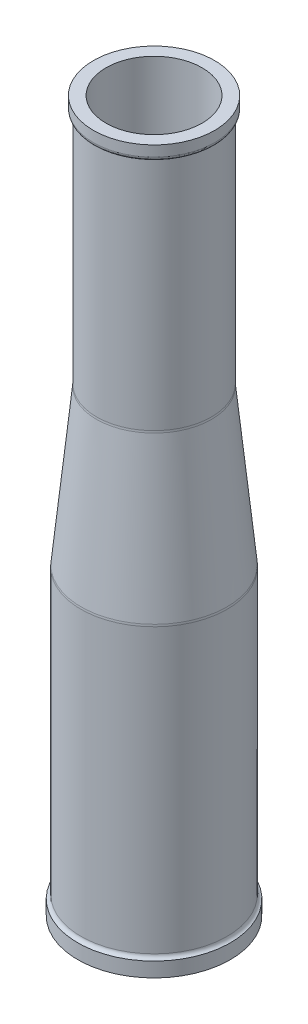
ISO-10303-21;
HEADER;
FILE_DESCRIPTION(('STEP AP214'),'2;1');
FILE_NAME('part.step','',(''),(''),'','','');
FILE_SCHEMA(('AUTOMOTIVE_DESIGN { 1 0 10303 214 1 1 1 1 }'));
ENDSEC;
DATA;
#1=APPLICATION_CONTEXT('core data for automotive mechanical design processes');
#2=APPLICATION_PROTOCOL_DEFINITION('international standard','automotive_design',2000,#1);
#3=PRODUCT_CONTEXT('',#1,'mechanical');
#4=PRODUCT('Part','Part','',(#3));
#5=PRODUCT_RELATED_PRODUCT_CATEGORY('part','',(#4));
#6=PRODUCT_DEFINITION_FORMATION('','',#4);
#7=PRODUCT_DEFINITION_CONTEXT('part definition',#1,'design');
#8=PRODUCT_DEFINITION('design','',#6,#7);
#9=PRODUCT_DEFINITION_SHAPE('','',#8);
#10=(LENGTH_UNIT() NAMED_UNIT(*) SI_UNIT(.MILLI.,.METRE.));
#11=(NAMED_UNIT(*) PLANE_ANGLE_UNIT() SI_UNIT($,.RADIAN.));
#12=(NAMED_UNIT(*) SI_UNIT($,.STERADIAN.) SOLID_ANGLE_UNIT());
#13=UNCERTAINTY_MEASURE_WITH_UNIT(LENGTH_MEASURE(1.E-05),#10,'distance_accuracy_value','');
#14=(GEOMETRIC_REPRESENTATION_CONTEXT(3) GLOBAL_UNCERTAINTY_ASSIGNED_CONTEXT((#13)) GLOBAL_UNIT_ASSIGNED_CONTEXT((#10,
#11,#12)) REPRESENTATION_CONTEXT('',''));
#15=CARTESIAN_POINT('',(0.,0.,0.));
#16=DIRECTION('',(0.,0.,1.));
#17=DIRECTION('',(1.,0.,0.));
#18=AXIS2_PLACEMENT_3D('',#15,#16,#17);
#19=CARTESIAN_POINT('',(0.,340.,0.));
#20=DIRECTION('',(0.,-1.,0.));
#21=DIRECTION('',(0.,0.,-1.));
#22=AXIS2_PLACEMENT_3D('',#19,#20,#21);
#23=CYLINDRICAL_SURFACE('',#22,27.5);
#24=CARTESIAN_POINT('',(0.,220.498756211209,0.));
#25=DIRECTION('',(0.,1.,0.));
#26=DIRECTION('',(0.,0.,1.));
#27=AXIS2_PLACEMENT_3D('',#24,#25,#26);
#28=CIRCLE('',#27,27.5);
#29=CARTESIAN_POINT('',(0.,220.498756211209,27.5));
#30=VERTEX_POINT('',#29);
#31=EDGE_CURVE('E63',#30,#30,#28,.T.);
#32=ORIENTED_EDGE('',*,*,#31,.T.);
#33=EDGE_LOOP('',(#32));
#34=FACE_BOUND('',#33,.T.);
#35=CARTESIAN_POINT('',(0.,333.,0.));
#36=DIRECTION('',(0.,1.,0.));
#37=DIRECTION('',(0.,0.,1.));
#38=AXIS2_PLACEMENT_3D('',#35,#36,#37);
#39=CIRCLE('',#38,27.5);
#40=CARTESIAN_POINT('',(0.,333.,27.5));
#41=VERTEX_POINT('',#40);
#42=EDGE_CURVE('E48',#41,#41,#39,.T.);
#43=ORIENTED_EDGE('',*,*,#42,.F.);
#44=EDGE_LOOP('',(#43));
#45=FACE_BOUND('',#44,.T.);
#46=ADVANCED_FACE('F37',(#34,#45),#23,.T.);
#47=CARTESIAN_POINT('',(0.,145.,0.));
#48=DIRECTION('',(0.,-1.,0.));
#49=DIRECTION('',(0.,0.,-1.));
#50=AXIS2_PLACEMENT_3D('',#47,#48,#49);
#51=CYLINDRICAL_SURFACE('',#50,35.);
#52=CARTESIAN_POINT('',(0.,8.9364916731037,0.));
#53=DIRECTION('',(0.,-1.,0.));
#54=DIRECTION('',(0.,0.,-1.));
#55=AXIS2_PLACEMENT_3D('',#52,#53,#54);
#56=CIRCLE('',#55,35.);
#57=CARTESIAN_POINT('',(0.,8.9364916731037,-35.));
#58=VERTEX_POINT('',#57);
#59=EDGE_CURVE('E11',#58,#58,#56,.F.);
#60=ORIENTED_EDGE('',*,*,#59,.T.);
#61=EDGE_LOOP('',(#60));
#62=FACE_BOUND('',#61,.T.);
#63=CARTESIAN_POINT('',(0.,144.501243788791,0.));
#64=DIRECTION('',(0.,-1.,0.));
#65=DIRECTION('',(0.,0.,-1.));
#66=AXIS2_PLACEMENT_3D('',#63,#64,#65);
#67=CIRCLE('',#66,35.);
#68=CARTESIAN_POINT('',(0.,144.501243788791,-35.));
#69=VERTEX_POINT('',#68);
#70=EDGE_CURVE('E52',#69,#69,#67,.T.);
#71=ORIENTED_EDGE('',*,*,#70,.T.);
#72=EDGE_LOOP('',(#71));
#73=FACE_BOUND('',#72,.T.);
#74=ADVANCED_FACE('F99',(#62,#73),#51,.T.);
#75=CARTESIAN_POINT('',(0.,220.,0.));
#76=DIRECTION('',(0.,-1.,0.));
#77=DIRECTION('',(0.,0.,-1.));
#78=AXIS2_PLACEMENT_3D('',#75,#76,#77);
#79=CONICAL_SURFACE('',#78,27.5,0.0996686524911622);
#80=CARTESIAN_POINT('',(0.,219.503719020999,0.));
#81=DIRECTION('',(0.,1.,0.));
#82=DIRECTION('',(0.,0.,1.));
#83=AXIS2_PLACEMENT_3D('',#80,#81,#82);
#84=CIRCLE('',#83,27.5496280979001);
#85=CARTESIAN_POINT('',(0.,219.503719020999,27.5496280979001));
#86=VERTEX_POINT('',#85);
#87=EDGE_CURVE('E57',#86,#86,#84,.F.);
#88=ORIENTED_EDGE('',*,*,#87,.T.);
#89=EDGE_LOOP('',(#88));
#90=FACE_BOUND('',#89,.T.);
#91=CARTESIAN_POINT('',(0.,145.496280979001,0.));
#92=DIRECTION('',(0.,-1.,0.));
#93=DIRECTION('',(0.,0.,-1.));
#94=AXIS2_PLACEMENT_3D('',#91,#92,#93);
#95=CIRCLE('',#94,34.9503719020999);
#96=CARTESIAN_POINT('',(0.,145.496280979001,-34.9503719020999));
#97=VERTEX_POINT('',#96);
#98=EDGE_CURVE('E60',#97,#97,#95,.F.);
#99=ORIENTED_EDGE('',*,*,#98,.T.);
#100=EDGE_LOOP('',(#99));
#101=FACE_BOUND('',#100,.T.);
#102=ADVANCED_FACE('F105',(#90,#101),#79,.T.);
#103=CARTESIAN_POINT('',(0.,340.,0.));
#104=DIRECTION('',(0.,1.,0.));
#105=DIRECTION('',(0.,0.,1.));
#106=AXIS2_PLACEMENT_3D('',#103,#104,#105);
#107=PLANE('',#106);
#108=CARTESIAN_POINT('',(0.,340.,0.));
#109=DIRECTION('',(0.,1.,0.));
#110=DIRECTION('',(0.,0.,1.));
#111=AXIS2_PLACEMENT_3D('',#108,#109,#110);
#112=CIRCLE('',#111,23.);
#113=CARTESIAN_POINT('',(0.,340.,23.));
#114=VERTEX_POINT('',#113);
#115=EDGE_CURVE('E70',#114,#114,#112,.T.);
#116=ORIENTED_EDGE('',*,*,#115,.F.);
#117=EDGE_LOOP('',(#116));
#118=FACE_BOUND('',#117,.T.);
#119=CARTESIAN_POINT('',(0.,340.,0.));
#120=DIRECTION('',(0.,1.,0.));
#121=DIRECTION('',(0.,0.,1.));
#122=AXIS2_PLACEMENT_3D('',#119,#120,#121);
#123=CIRCLE('',#122,29.);
#124=CARTESIAN_POINT('',(0.,340.,29.));
#125=VERTEX_POINT('',#124);
#126=EDGE_CURVE('E77',#125,#125,#123,.T.);
#127=ORIENTED_EDGE('',*,*,#126,.T.);
#128=EDGE_LOOP('',(#127));
#129=FACE_BOUND('',#128,.T.);
#130=ADVANCED_FACE('F82',(#118,#129),#107,.T.);
#131=CARTESIAN_POINT('',(0.,7.,0.));
#132=DIRECTION('',(0.,-1.,0.));
#133=DIRECTION('',(0.,0.,-1.));
#134=AXIS2_PLACEMENT_3D('',#131,#132,#133);
#135=CYLINDRICAL_SURFACE('',#134,36.5);
#136=CARTESIAN_POINT('',(0.,7.,0.));
#137=DIRECTION('',(0.,-1.,0.));
#138=DIRECTION('',(0.,0.,-1.));
#139=AXIS2_PLACEMENT_3D('',#136,#137,#138);
#140=CIRCLE('',#139,36.5);
#141=CARTESIAN_POINT('',(0.,7.,-36.5));
#142=VERTEX_POINT('',#141);
#143=EDGE_CURVE('E66',#142,#142,#140,.T.);
#144=ORIENTED_EDGE('',*,*,#143,.T.);
#145=EDGE_LOOP('',(#144));
#146=FACE_BOUND('',#145,.T.);
#147=CARTESIAN_POINT('',(0.,0.,0.));
#148=DIRECTION('',(0.,-1.,0.));
#149=DIRECTION('',(0.,0.,-1.));
#150=AXIS2_PLACEMENT_3D('',#147,#148,#149);
#151=CIRCLE('',#150,36.5);
#152=CARTESIAN_POINT('',(0.,0.,-36.5));
#153=VERTEX_POINT('',#152);
#154=EDGE_CURVE('E67',#153,#153,#151,.T.);
#155=ORIENTED_EDGE('',*,*,#154,.F.);
#156=EDGE_LOOP('',(#155));
#157=FACE_BOUND('',#156,.T.);
#158=ADVANCED_FACE('F117',(#146,#157),#135,.T.);
#159=CARTESIAN_POINT('',(0.,0.,0.));
#160=DIRECTION('',(0.,1.,0.));
#161=DIRECTION('',(0.,0.,1.));
#162=AXIS2_PLACEMENT_3D('',#159,#160,#161);
#163=PLANE('',#162);
#164=CARTESIAN_POINT('',(0.,0.,0.));
#165=DIRECTION('',(0.,-1.,0.));
#166=DIRECTION('',(0.,0.,-1.));
#167=AXIS2_PLACEMENT_3D('',#164,#165,#166);
#168=CIRCLE('',#167,23.);
#169=CARTESIAN_POINT('',(0.,0.,-23.));
#170=VERTEX_POINT('',#169);
#171=EDGE_CURVE('E75',#170,#170,#168,.T.);
#172=ORIENTED_EDGE('',*,*,#171,.F.);
#173=EDGE_LOOP('',(#172));
#174=FACE_BOUND('',#173,.T.);
#175=ORIENTED_EDGE('',*,*,#154,.T.);
#176=EDGE_LOOP('',(#175));
#177=FACE_BOUND('',#176,.T.);
#178=ADVANCED_FACE('F114',(#174,#177),#163,.F.);
#179=CARTESIAN_POINT('',(0.,525.,0.));
#180=DIRECTION('',(0.,-1.,0.));
#181=DIRECTION('',(0.,0.,-1.));
#182=AXIS2_PLACEMENT_3D('',#179,#180,#181);
#183=CYLINDRICAL_SURFACE('',#182,23.);
#184=ORIENTED_EDGE('',*,*,#115,.T.);
#185=EDGE_LOOP('',(#184));
#186=FACE_BOUND('',#185,.T.);
#187=ORIENTED_EDGE('',*,*,#171,.T.);
#188=EDGE_LOOP('',(#187));
#189=FACE_BOUND('',#188,.T.);
#190=ADVANCED_FACE('F116',(#186,#189),#183,.F.);
#191=CARTESIAN_POINT('',(0.,220.498756211209,0.));
#192=DIRECTION('',(0.,1.,0.));
#193=DIRECTION('',(0.,0.,1.));
#194=AXIS2_PLACEMENT_3D('',#191,#192,#193);
#195=TOROIDAL_SURFACE('',#194,37.5,10.);
#196=ORIENTED_EDGE('',*,*,#87,.F.);
#197=EDGE_LOOP('',(#196));
#198=FACE_BOUND('',#197,.T.);
#199=ORIENTED_EDGE('',*,*,#31,.F.);
#200=EDGE_LOOP('',(#199));
#201=FACE_BOUND('',#200,.T.);
#202=ADVANCED_FACE('F94',(#198,#201),#195,.F.);
#203=CARTESIAN_POINT('',(0.,144.501243788791,0.));
#204=DIRECTION('',(0.,-1.,0.));
#205=DIRECTION('',(0.,0.,-1.));
#206=AXIS2_PLACEMENT_3D('',#203,#204,#205);
#207=TOROIDAL_SURFACE('',#206,25.,10.);
#208=ORIENTED_EDGE('',*,*,#70,.F.);
#209=EDGE_LOOP('',(#208));
#210=FACE_BOUND('',#209,.T.);
#211=ORIENTED_EDGE('',*,*,#98,.F.);
#212=EDGE_LOOP('',(#211));
#213=FACE_BOUND('',#212,.T.);
#214=ADVANCED_FACE('F87',(#210,#213),#207,.T.);
#215=CARTESIAN_POINT('',(0.,333.,0.));
#216=DIRECTION('',(0.,1.,0.));
#217=DIRECTION('',(0.,0.,1.));
#218=AXIS2_PLACEMENT_3D('',#215,#216,#217);
#219=CYLINDRICAL_SURFACE('',#218,29.);
#220=CARTESIAN_POINT('',(0.,334.936491673104,0.));
#221=DIRECTION('',(0.,-1.,0.));
#222=DIRECTION('',(0.,0.,-1.));
#223=AXIS2_PLACEMENT_3D('',#220,#221,#222);
#224=CIRCLE('',#223,29.);
#225=CARTESIAN_POINT('',(0.,334.936491673104,-29.));
#226=VERTEX_POINT('',#225);
#227=EDGE_CURVE('E44',#226,#226,#224,.F.);
#228=ORIENTED_EDGE('',*,*,#227,.T.);
#229=EDGE_LOOP('',(#228));
#230=FACE_BOUND('',#229,.T.);
#231=ORIENTED_EDGE('',*,*,#126,.F.);
#232=EDGE_LOOP('',(#231));
#233=FACE_BOUND('',#232,.T.);
#234=ADVANCED_FACE('F84',(#230,#233),#219,.T.);
#235=CARTESIAN_POINT('',(0.,334.936491673104,0.));
#236=DIRECTION('',(0.,-1.,0.));
#237=DIRECTION('',(0.,0.,-1.));
#238=AXIS2_PLACEMENT_3D('',#235,#236,#237);
#239=TOROIDAL_SURFACE('',#238,27.,2.);
#240=ORIENTED_EDGE('',*,*,#42,.T.);
#241=EDGE_LOOP('',(#240));
#242=FACE_BOUND('',#241,.T.);
#243=ORIENTED_EDGE('',*,*,#227,.F.);
#244=EDGE_LOOP('',(#243));
#245=FACE_BOUND('',#244,.T.);
#246=ADVANCED_FACE('F86',(#242,#245),#239,.T.);
#247=CARTESIAN_POINT('',(0.,8.93649167310371,0.));
#248=DIRECTION('',(0.,-1.,0.));
#249=DIRECTION('',(0.,0.,-1.));
#250=AXIS2_PLACEMENT_3D('',#247,#248,#249);
#251=TOROIDAL_SURFACE('',#250,37.,2.);
#252=ORIENTED_EDGE('',*,*,#59,.F.);
#253=EDGE_LOOP('',(#252));
#254=FACE_BOUND('',#253,.T.);
#255=ORIENTED_EDGE('',*,*,#143,.F.);
#256=EDGE_LOOP('',(#255));
#257=FACE_BOUND('',#256,.T.);
#258=ADVANCED_FACE('F39',(#254,#257),#251,.F.);
#259=CLOSED_SHELL('',(#46,#74,#102,#130,#158,#178,#190,#202,#214,#234,#246,#258));
#260=MANIFOLD_SOLID_BREP('B2',#259);
#261=ADVANCED_BREP_SHAPE_REPRESENTATION('',(#18,#260),#14);
#262=SHAPE_DEFINITION_REPRESENTATION(#9,#261);
ENDSEC;
END-ISO-10303-21;
